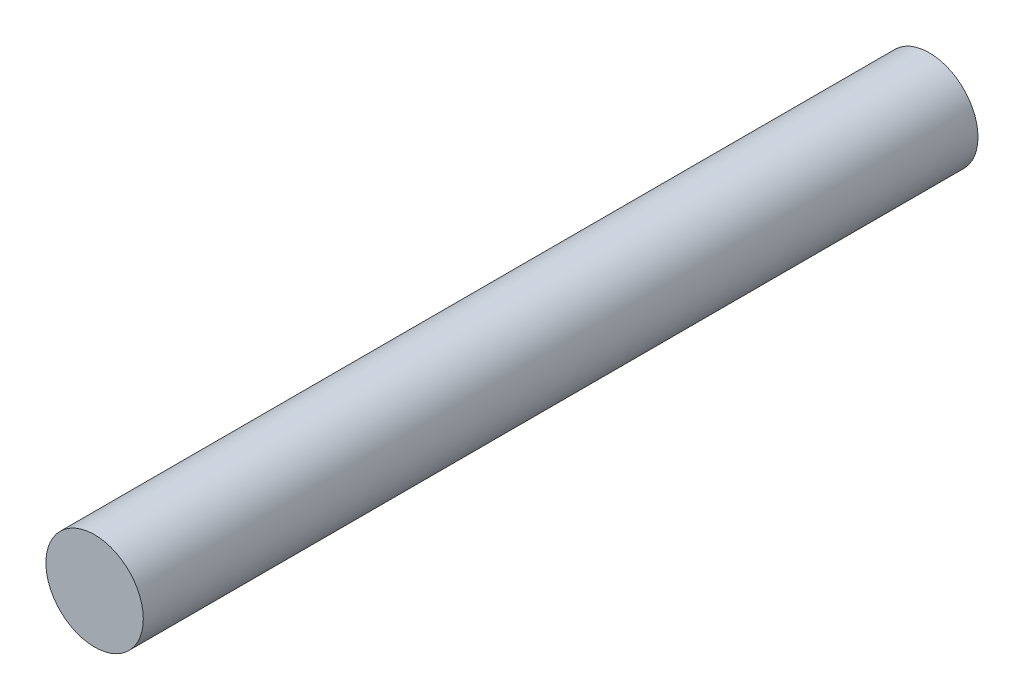
ISO-10303-21;
HEADER;
FILE_DESCRIPTION(('STEP AP214'),'2;1');
FILE_NAME('part.step','',(''),(''),'','','');
FILE_SCHEMA(('AUTOMOTIVE_DESIGN { 1 0 10303 214 1 1 1 1 }'));
ENDSEC;
DATA;
#1=APPLICATION_CONTEXT('core data for automotive mechanical design processes');
#2=APPLICATION_PROTOCOL_DEFINITION('international standard','automotive_design',2000,#1);
#3=PRODUCT_CONTEXT('',#1,'mechanical');
#4=PRODUCT('Part','Part','',(#3));
#5=PRODUCT_RELATED_PRODUCT_CATEGORY('part','',(#4));
#6=PRODUCT_DEFINITION_FORMATION('','',#4);
#7=PRODUCT_DEFINITION_CONTEXT('part definition',#1,'design');
#8=PRODUCT_DEFINITION('design','',#6,#7);
#9=PRODUCT_DEFINITION_SHAPE('','',#8);
#10=(LENGTH_UNIT() NAMED_UNIT(*) SI_UNIT(.MILLI.,.METRE.));
#11=(NAMED_UNIT(*) PLANE_ANGLE_UNIT() SI_UNIT($,.RADIAN.));
#12=(NAMED_UNIT(*) SI_UNIT($,.STERADIAN.) SOLID_ANGLE_UNIT());
#13=UNCERTAINTY_MEASURE_WITH_UNIT(LENGTH_MEASURE(1.E-05),#10,'distance_accuracy_value','');
#14=(GEOMETRIC_REPRESENTATION_CONTEXT(3) GLOBAL_UNCERTAINTY_ASSIGNED_CONTEXT((#13)) GLOBAL_UNIT_ASSIGNED_CONTEXT((#10,
#11,#12)) REPRESENTATION_CONTEXT('',''));
#15=CARTESIAN_POINT('',(0.,0.,0.));
#16=DIRECTION('',(0.,0.,1.));
#17=DIRECTION('',(1.,0.,0.));
#18=AXIS2_PLACEMENT_3D('',#15,#16,#17);
#19=CARTESIAN_POINT('',(0.,0.,300.));
#20=DIRECTION('',(0.,0.,-1.));
#21=DIRECTION('',(-1.,0.,0.));
#22=AXIS2_PLACEMENT_3D('',#19,#20,#21);
#23=CYLINDRICAL_SURFACE('',#22,17.5);
#24=CARTESIAN_POINT('',(0.,0.,300.));
#25=DIRECTION('',(0.,0.,1.));
#26=DIRECTION('',(1.,0.,0.));
#27=AXIS2_PLACEMENT_3D('',#24,#25,#26);
#28=CIRCLE('',#27,17.5);
#29=CARTESIAN_POINT('',(17.5,0.,300.));
#30=VERTEX_POINT('',#29);
#31=EDGE_CURVE('E10',#30,#30,#28,.T.);
#32=ORIENTED_EDGE('',*,*,#31,.F.);
#33=EDGE_LOOP('',(#32));
#34=FACE_BOUND('',#33,.T.);
#35=CARTESIAN_POINT('',(0.,0.,0.));
#36=DIRECTION('',(0.,0.,1.));
#37=DIRECTION('',(1.,0.,0.));
#38=AXIS2_PLACEMENT_3D('',#35,#36,#37);
#39=CIRCLE('',#38,17.5);
#40=CARTESIAN_POINT('',(17.5,0.,0.));
#41=VERTEX_POINT('',#40);
#42=EDGE_CURVE('E46',#41,#41,#39,.T.);
#43=ORIENTED_EDGE('',*,*,#42,.T.);
#44=EDGE_LOOP('',(#43));
#45=FACE_BOUND('',#44,.T.);
#46=ADVANCED_FACE('F43',(#34,#45),#23,.T.);
#47=CARTESIAN_POINT('',(0.,0.,300.));
#48=DIRECTION('',(0.,0.,1.));
#49=DIRECTION('',(1.,0.,0.));
#50=AXIS2_PLACEMENT_3D('',#47,#48,#49);
#51=PLANE('',#50);
#52=ORIENTED_EDGE('',*,*,#31,.T.);
#53=EDGE_LOOP('',(#52));
#54=FACE_BOUND('',#53,.T.);
#55=ADVANCED_FACE('F60',(#54),#51,.T.);
#56=CARTESIAN_POINT('',(0.,0.,0.));
#57=DIRECTION('',(0.,0.,1.));
#58=DIRECTION('',(1.,0.,0.));
#59=AXIS2_PLACEMENT_3D('',#56,#57,#58);
#60=PLANE('',#59);
#61=ORIENTED_EDGE('',*,*,#42,.F.);
#62=EDGE_LOOP('',(#61));
#63=FACE_BOUND('',#62,.T.);
#64=ADVANCED_FACE('F58',(#63),#60,.F.);
#65=CLOSED_SHELL('',(#46,#55,#64));
#66=MANIFOLD_SOLID_BREP('B2',#65);
#67=ADVANCED_BREP_SHAPE_REPRESENTATION('',(#18,#66),#14);
#68=SHAPE_DEFINITION_REPRESENTATION(#9,#67);
ENDSEC;
END-ISO-10303-21;
